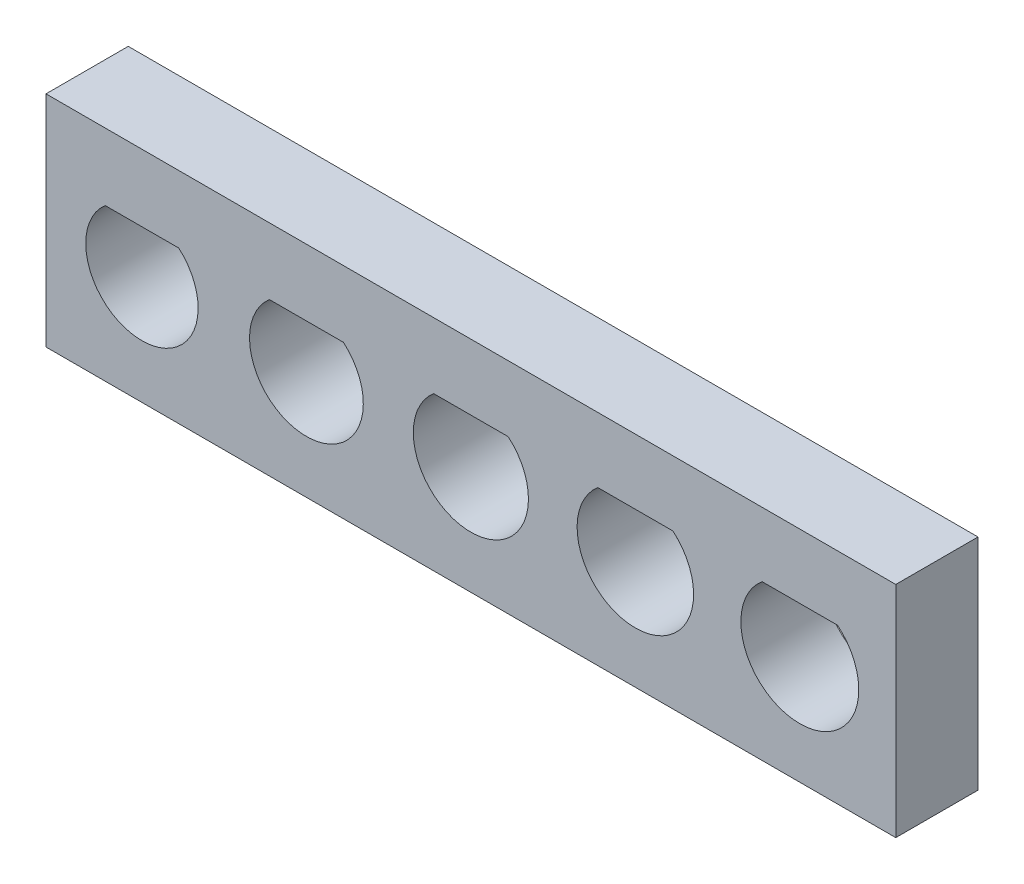
ISO-10303-21;
HEADER;
FILE_DESCRIPTION(('STEP AP214'),'2;1');
FILE_NAME('part.step','',(''),(''),'','','');
FILE_SCHEMA(('AUTOMOTIVE_DESIGN { 1 0 10303 214 1 1 1 1 }'));
ENDSEC;
DATA;
#1=APPLICATION_CONTEXT('core data for automotive mechanical design processes');
#2=APPLICATION_PROTOCOL_DEFINITION('international standard','automotive_design',2000,#1);
#3=PRODUCT_CONTEXT('',#1,'mechanical');
#4=PRODUCT('Part','Part','',(#3));
#5=PRODUCT_RELATED_PRODUCT_CATEGORY('part','',(#4));
#6=PRODUCT_DEFINITION_FORMATION('','',#4);
#7=PRODUCT_DEFINITION_CONTEXT('part definition',#1,'design');
#8=PRODUCT_DEFINITION('design','',#6,#7);
#9=PRODUCT_DEFINITION_SHAPE('','',#8);
#10=(LENGTH_UNIT() NAMED_UNIT(*) SI_UNIT(.MILLI.,.METRE.));
#11=(NAMED_UNIT(*) PLANE_ANGLE_UNIT() SI_UNIT($,.RADIAN.));
#12=(NAMED_UNIT(*) SI_UNIT($,.STERADIAN.) SOLID_ANGLE_UNIT());
#13=UNCERTAINTY_MEASURE_WITH_UNIT(LENGTH_MEASURE(1.E-05),#10,'distance_accuracy_value','');
#14=(GEOMETRIC_REPRESENTATION_CONTEXT(3) GLOBAL_UNCERTAINTY_ASSIGNED_CONTEXT((#13)) GLOBAL_UNIT_ASSIGNED_CONTEXT((#10,
#11,#12)) REPRESENTATION_CONTEXT('',''));
#15=CARTESIAN_POINT('',(0.,0.,0.));
#16=DIRECTION('',(0.,0.,1.));
#17=DIRECTION('',(1.,0.,0.));
#18=AXIS2_PLACEMENT_3D('',#15,#16,#17);
#19=CARTESIAN_POINT('',(0.,0.,3.));
#20=DIRECTION('',(0.,0.,-1.));
#21=DIRECTION('',(-1.,0.,0.));
#22=AXIS2_PLACEMENT_3D('',#19,#20,#21);
#23=PLANE('',#22);
#24=CARTESIAN_POINT('',(21.5,4.,3.));
#25=DIRECTION('',(0.,0.,1.));
#26=DIRECTION('',(1.,0.,0.));
#27=AXIS2_PLACEMENT_3D('',#24,#25,#26);
#28=CIRCLE('',#27,2.125);
#29=CARTESIAN_POINT('',(20.1306936062371,5.625,3.));
#30=VERTEX_POINT('',#29);
#31=CARTESIAN_POINT('',(22.8693063937629,5.625,3.));
#32=VERTEX_POINT('',#31);
#33=EDGE_CURVE('E155',#30,#32,#28,.T.);
#34=ORIENTED_EDGE('',*,*,#33,.F.);
#35=DIRECTION('',(-1.,0.,0.));
#36=VECTOR('',#35,1.);
#37=CARTESIAN_POINT('',(20.1306936062371,5.625,3.));
#38=LINE('',#37,#36);
#39=EDGE_CURVE('E158',#32,#30,#38,.T.);
#40=ORIENTED_EDGE('',*,*,#39,.F.);
#41=EDGE_LOOP('',(#34,#40));
#42=FACE_BOUND('',#41,.T.);
#43=CARTESIAN_POINT('',(9.5,4.,3.));
#44=DIRECTION('',(0.,0.,1.));
#45=DIRECTION('',(1.,0.,0.));
#46=AXIS2_PLACEMENT_3D('',#43,#44,#45);
#47=CIRCLE('',#46,2.075);
#48=CARTESIAN_POINT('',(8.14907439138937,5.575,3.));
#49=VERTEX_POINT('',#48);
#50=CARTESIAN_POINT('',(10.8509256086106,5.575,3.));
#51=VERTEX_POINT('',#50);
#52=EDGE_CURVE('E189',#49,#51,#47,.T.);
#53=ORIENTED_EDGE('',*,*,#52,.F.);
#54=DIRECTION('',(-1.,0.,0.));
#55=VECTOR('',#54,1.);
#56=CARTESIAN_POINT('',(8.14907439138937,5.575,3.));
#57=LINE('',#56,#55);
#58=EDGE_CURVE('E192',#51,#49,#57,.T.);
#59=ORIENTED_EDGE('',*,*,#58,.F.);
#60=EDGE_LOOP('',(#53,#59));
#61=FACE_BOUND('',#60,.T.);
#62=DIRECTION('',(0.,-1.,0.));
#63=VECTOR('',#62,1.);
#64=CARTESIAN_POINT('',(0.,0.,3.));
#65=LINE('',#64,#63);
#66=CARTESIAN_POINT('',(0.,8.,3.));
#67=VERTEX_POINT('',#66);
#68=CARTESIAN_POINT('',(0.,0.,3.));
#69=VERTEX_POINT('',#68);
#70=EDGE_CURVE('E223',#67,#69,#65,.T.);
#71=ORIENTED_EDGE('',*,*,#70,.T.);
#72=DIRECTION('',(1.,0.,0.));
#73=VECTOR('',#72,1.);
#74=CARTESIAN_POINT('',(0.,0.,3.));
#75=LINE('',#74,#73);
#76=CARTESIAN_POINT('',(31.,0.,3.));
#77=VERTEX_POINT('',#76);
#78=EDGE_CURVE('E226',#69,#77,#75,.T.);
#79=ORIENTED_EDGE('',*,*,#78,.T.);
#80=DIRECTION('',(0.,1.,0.));
#81=VECTOR('',#80,1.);
#82=CARTESIAN_POINT('',(31.,0.,3.));
#83=LINE('',#82,#81);
#84=CARTESIAN_POINT('',(31.,8.,3.));
#85=VERTEX_POINT('',#84);
#86=EDGE_CURVE('E229',#77,#85,#83,.T.);
#87=ORIENTED_EDGE('',*,*,#86,.T.);
#88=DIRECTION('',(-1.,0.,0.));
#89=VECTOR('',#88,1.);
#90=CARTESIAN_POINT('',(0.,8.,3.));
#91=LINE('',#90,#89);
#92=EDGE_CURVE('E231',#85,#67,#91,.T.);
#93=ORIENTED_EDGE('',*,*,#92,.T.);
#94=EDGE_LOOP('',(#71,#79,#87,#93));
#95=FACE_BOUND('',#94,.T.);
#96=CARTESIAN_POINT('',(3.5,4.,3.));
#97=DIRECTION('',(0.,0.,1.));
#98=DIRECTION('',(1.,0.,0.));
#99=AXIS2_PLACEMENT_3D('',#96,#97,#98);
#100=CIRCLE('',#99,2.05);
#101=CARTESIAN_POINT('',(2.15835921350013,5.55,3.));
#102=VERTEX_POINT('',#101);
#103=CARTESIAN_POINT('',(4.84164078649987,5.55,3.));
#104=VERTEX_POINT('',#103);
#105=EDGE_CURVE('E206',#102,#104,#100,.T.);
#106=ORIENTED_EDGE('',*,*,#105,.F.);
#107=DIRECTION('',(-1.,0.,0.));
#108=VECTOR('',#107,1.);
#109=CARTESIAN_POINT('',(2.15835921350013,5.55,3.));
#110=LINE('',#109,#108);
#111=EDGE_CURVE('E209',#104,#102,#110,.T.);
#112=ORIENTED_EDGE('',*,*,#111,.F.);
#113=EDGE_LOOP('',(#106,#112));
#114=FACE_BOUND('',#113,.T.);
#115=CARTESIAN_POINT('',(15.5,4.,3.));
#116=DIRECTION('',(0.,0.,1.));
#117=DIRECTION('',(1.,0.,0.));
#118=AXIS2_PLACEMENT_3D('',#115,#116,#117);
#119=CIRCLE('',#118,2.1);
#120=CARTESIAN_POINT('',(14.1398529491265,5.6,3.));
#121=VERTEX_POINT('',#120);
#122=CARTESIAN_POINT('',(16.8601470508735,5.6,3.));
#123=VERTEX_POINT('',#122);
#124=EDGE_CURVE('E172',#121,#123,#119,.T.);
#125=ORIENTED_EDGE('',*,*,#124,.F.);
#126=DIRECTION('',(-1.,0.,0.));
#127=VECTOR('',#126,1.);
#128=CARTESIAN_POINT('',(14.1398529491265,5.6,3.));
#129=LINE('',#128,#127);
#130=EDGE_CURVE('E175',#123,#121,#129,.T.);
#131=ORIENTED_EDGE('',*,*,#130,.F.);
#132=EDGE_LOOP('',(#125,#131));
#133=FACE_BOUND('',#132,.T.);
#134=CARTESIAN_POINT('',(27.5,4.,3.));
#135=DIRECTION('',(0.,0.,1.));
#136=DIRECTION('',(1.,0.,0.));
#137=AXIS2_PLACEMENT_3D('',#134,#135,#136);
#138=CIRCLE('',#137,2.15);
#139=CARTESIAN_POINT('',(26.121595124791,5.65,3.));
#140=VERTEX_POINT('',#139);
#141=CARTESIAN_POINT('',(28.878404875209,5.65,3.));
#142=VERTEX_POINT('',#141);
#143=EDGE_CURVE('E144',#140,#142,#138,.T.);
#144=ORIENTED_EDGE('',*,*,#143,.F.);
#145=DIRECTION('',(-1.,0.,0.));
#146=VECTOR('',#145,1.);
#147=CARTESIAN_POINT('',(26.121595124791,5.65,3.));
#148=LINE('',#147,#146);
#149=EDGE_CURVE('E138',#142,#140,#148,.T.);
#150=ORIENTED_EDGE('',*,*,#149,.F.);
#151=EDGE_LOOP('',(#144,#150));
#152=FACE_BOUND('',#151,.T.);
#153=ADVANCED_FACE('F38',(#42,#61,#95,#114,#133,#152),#23,.F.);
#154=CARTESIAN_POINT('',(0.,0.,0.));
#155=DIRECTION('',(0.,0.,-1.));
#156=DIRECTION('',(-1.,0.,0.));
#157=AXIS2_PLACEMENT_3D('',#154,#155,#156);
#158=PLANE('',#157);
#159=DIRECTION('',(0.,-1.,0.));
#160=VECTOR('',#159,1.);
#161=CARTESIAN_POINT('',(0.,0.,0.));
#162=LINE('',#161,#160);
#163=CARTESIAN_POINT('',(0.,8.,0.));
#164=VERTEX_POINT('',#163);
#165=CARTESIAN_POINT('',(0.,0.,0.));
#166=VERTEX_POINT('',#165);
#167=EDGE_CURVE('E222',#164,#166,#162,.T.);
#168=ORIENTED_EDGE('',*,*,#167,.F.);
#169=DIRECTION('',(-1.,0.,0.));
#170=VECTOR('',#169,1.);
#171=CARTESIAN_POINT('',(0.,8.,0.));
#172=LINE('',#171,#170);
#173=CARTESIAN_POINT('',(31.,8.,0.));
#174=VERTEX_POINT('',#173);
#175=EDGE_CURVE('E227',#174,#164,#172,.T.);
#176=ORIENTED_EDGE('',*,*,#175,.F.);
#177=DIRECTION('',(0.,1.,0.));
#178=VECTOR('',#177,1.);
#179=CARTESIAN_POINT('',(31.,0.,0.));
#180=LINE('',#179,#178);
#181=CARTESIAN_POINT('',(31.,0.,0.));
#182=VERTEX_POINT('',#181);
#183=EDGE_CURVE('E238',#182,#174,#180,.T.);
#184=ORIENTED_EDGE('',*,*,#183,.F.);
#185=DIRECTION('',(1.,0.,0.));
#186=VECTOR('',#185,1.);
#187=CARTESIAN_POINT('',(0.,0.,0.));
#188=LINE('',#187,#186);
#189=EDGE_CURVE('E236',#166,#182,#188,.T.);
#190=ORIENTED_EDGE('',*,*,#189,.F.);
#191=EDGE_LOOP('',(#168,#176,#184,#190));
#192=FACE_BOUND('',#191,.T.);
#193=DIRECTION('',(-1.,0.,0.));
#194=VECTOR('',#193,1.);
#195=CARTESIAN_POINT('',(2.15835921350013,5.55,0.));
#196=LINE('',#195,#194);
#197=CARTESIAN_POINT('',(4.84164078649987,5.55,0.));
#198=VERTEX_POINT('',#197);
#199=CARTESIAN_POINT('',(2.15835921350013,5.55,0.));
#200=VERTEX_POINT('',#199);
#201=EDGE_CURVE('E210',#198,#200,#196,.T.);
#202=ORIENTED_EDGE('',*,*,#201,.T.);
#203=CARTESIAN_POINT('',(3.5,4.,0.));
#204=DIRECTION('',(0.,0.,1.));
#205=DIRECTION('',(1.,0.,0.));
#206=AXIS2_PLACEMENT_3D('',#203,#204,#205);
#207=CIRCLE('',#206,2.05);
#208=EDGE_CURVE('E205',#200,#198,#207,.T.);
#209=ORIENTED_EDGE('',*,*,#208,.T.);
#210=EDGE_LOOP('',(#202,#209));
#211=FACE_BOUND('',#210,.T.);
#212=DIRECTION('',(-1.,0.,0.));
#213=VECTOR('',#212,1.);
#214=CARTESIAN_POINT('',(8.14907439138937,5.575,0.));
#215=LINE('',#214,#213);
#216=CARTESIAN_POINT('',(10.8509256086106,5.575,0.));
#217=VERTEX_POINT('',#216);
#218=CARTESIAN_POINT('',(8.14907439138937,5.575,0.));
#219=VERTEX_POINT('',#218);
#220=EDGE_CURVE('E193',#217,#219,#215,.T.);
#221=ORIENTED_EDGE('',*,*,#220,.T.);
#222=CARTESIAN_POINT('',(9.5,4.,0.));
#223=DIRECTION('',(0.,0.,1.));
#224=DIRECTION('',(1.,0.,0.));
#225=AXIS2_PLACEMENT_3D('',#222,#223,#224);
#226=CIRCLE('',#225,2.075);
#227=EDGE_CURVE('E188',#219,#217,#226,.T.);
#228=ORIENTED_EDGE('',*,*,#227,.T.);
#229=EDGE_LOOP('',(#221,#228));
#230=FACE_BOUND('',#229,.T.);
#231=DIRECTION('',(-1.,0.,0.));
#232=VECTOR('',#231,1.);
#233=CARTESIAN_POINT('',(14.1398529491265,5.6,0.));
#234=LINE('',#233,#232);
#235=CARTESIAN_POINT('',(16.8601470508735,5.6,0.));
#236=VERTEX_POINT('',#235);
#237=CARTESIAN_POINT('',(14.1398529491265,5.6,0.));
#238=VERTEX_POINT('',#237);
#239=EDGE_CURVE('E176',#236,#238,#234,.T.);
#240=ORIENTED_EDGE('',*,*,#239,.T.);
#241=CARTESIAN_POINT('',(15.5,4.,0.));
#242=DIRECTION('',(0.,0.,1.));
#243=DIRECTION('',(1.,0.,0.));
#244=AXIS2_PLACEMENT_3D('',#241,#242,#243);
#245=CIRCLE('',#244,2.1);
#246=EDGE_CURVE('E171',#238,#236,#245,.T.);
#247=ORIENTED_EDGE('',*,*,#246,.T.);
#248=EDGE_LOOP('',(#240,#247));
#249=FACE_BOUND('',#248,.T.);
#250=DIRECTION('',(-1.,0.,0.));
#251=VECTOR('',#250,1.);
#252=CARTESIAN_POINT('',(20.1306936062371,5.625,0.));
#253=LINE('',#252,#251);
#254=CARTESIAN_POINT('',(22.8693063937629,5.625,0.));
#255=VERTEX_POINT('',#254);
#256=CARTESIAN_POINT('',(20.1306936062371,5.625,0.));
#257=VERTEX_POINT('',#256);
#258=EDGE_CURVE('E159',#255,#257,#253,.T.);
#259=ORIENTED_EDGE('',*,*,#258,.T.);
#260=CARTESIAN_POINT('',(21.5,4.,0.));
#261=DIRECTION('',(0.,0.,1.));
#262=DIRECTION('',(1.,0.,0.));
#263=AXIS2_PLACEMENT_3D('',#260,#261,#262);
#264=CIRCLE('',#263,2.125);
#265=EDGE_CURVE('E154',#257,#255,#264,.T.);
#266=ORIENTED_EDGE('',*,*,#265,.T.);
#267=EDGE_LOOP('',(#259,#266));
#268=FACE_BOUND('',#267,.T.);
#269=DIRECTION('',(-1.,0.,0.));
#270=VECTOR('',#269,1.);
#271=CARTESIAN_POINT('',(26.121595124791,5.65,0.));
#272=LINE('',#271,#270);
#273=CARTESIAN_POINT('',(28.878404875209,5.65,0.));
#274=VERTEX_POINT('',#273);
#275=CARTESIAN_POINT('',(26.121595124791,5.65,0.));
#276=VERTEX_POINT('',#275);
#277=EDGE_CURVE('E148',#274,#276,#272,.T.);
#278=ORIENTED_EDGE('',*,*,#277,.T.);
#279=CARTESIAN_POINT('',(27.5,4.,0.));
#280=DIRECTION('',(0.,0.,1.));
#281=DIRECTION('',(1.,0.,0.));
#282=AXIS2_PLACEMENT_3D('',#279,#280,#281);
#283=CIRCLE('',#282,2.15);
#284=EDGE_CURVE('E60',#276,#274,#283,.T.);
#285=ORIENTED_EDGE('',*,*,#284,.T.);
#286=EDGE_LOOP('',(#278,#285));
#287=FACE_BOUND('',#286,.T.);
#288=ADVANCED_FACE('F256',(#192,#211,#230,#249,#268,#287),#158,.T.);
#289=CARTESIAN_POINT('',(0.,0.,3.));
#290=DIRECTION('',(1.,0.,0.));
#291=DIRECTION('',(0.,0.,-1.));
#292=AXIS2_PLACEMENT_3D('',#289,#290,#291);
#293=PLANE('',#292);
#294=ORIENTED_EDGE('',*,*,#167,.T.);
#295=DIRECTION('',(0.,0.,-1.));
#296=VECTOR('',#295,1.);
#297=CARTESIAN_POINT('',(0.,0.,3.));
#298=LINE('',#297,#296);
#299=EDGE_CURVE('E11',#69,#166,#298,.T.);
#300=ORIENTED_EDGE('',*,*,#299,.F.);
#301=ORIENTED_EDGE('',*,*,#70,.F.);
#302=DIRECTION('',(0.,0.,-1.));
#303=VECTOR('',#302,1.);
#304=CARTESIAN_POINT('',(0.,8.,3.));
#305=LINE('',#304,#303);
#306=EDGE_CURVE('E233',#67,#164,#305,.T.);
#307=ORIENTED_EDGE('',*,*,#306,.T.);
#308=EDGE_LOOP('',(#294,#300,#301,#307));
#309=FACE_BOUND('',#308,.T.);
#310=ADVANCED_FACE('F40',(#309),#293,.F.);
#311=CARTESIAN_POINT('',(0.,0.,3.));
#312=DIRECTION('',(0.,1.,0.));
#313=DIRECTION('',(0.,0.,1.));
#314=AXIS2_PLACEMENT_3D('',#311,#312,#313);
#315=PLANE('',#314);
#316=ORIENTED_EDGE('',*,*,#189,.T.);
#317=DIRECTION('',(0.,0.,-1.));
#318=VECTOR('',#317,1.);
#319=CARTESIAN_POINT('',(31.,0.,3.));
#320=LINE('',#319,#318);
#321=EDGE_CURVE('E46',#77,#182,#320,.T.);
#322=ORIENTED_EDGE('',*,*,#321,.F.);
#323=ORIENTED_EDGE('',*,*,#78,.F.);
#324=ORIENTED_EDGE('',*,*,#299,.T.);
#325=EDGE_LOOP('',(#316,#322,#323,#324));
#326=FACE_BOUND('',#325,.T.);
#327=ADVANCED_FACE('F267',(#326),#315,.F.);
#328=CARTESIAN_POINT('',(31.,0.,3.));
#329=DIRECTION('',(-1.,0.,0.));
#330=DIRECTION('',(0.,0.,1.));
#331=AXIS2_PLACEMENT_3D('',#328,#329,#330);
#332=PLANE('',#331);
#333=ORIENTED_EDGE('',*,*,#183,.T.);
#334=DIRECTION('',(0.,0.,-1.));
#335=VECTOR('',#334,1.);
#336=CARTESIAN_POINT('',(31.,8.,3.));
#337=LINE('',#336,#335);
#338=EDGE_CURVE('E243',#85,#174,#337,.T.);
#339=ORIENTED_EDGE('',*,*,#338,.F.);
#340=ORIENTED_EDGE('',*,*,#86,.F.);
#341=ORIENTED_EDGE('',*,*,#321,.T.);
#342=EDGE_LOOP('',(#333,#339,#340,#341));
#343=FACE_BOUND('',#342,.T.);
#344=ADVANCED_FACE('F250',(#343),#332,.F.);
#345=CARTESIAN_POINT('',(0.,8.,3.));
#346=DIRECTION('',(0.,-1.,0.));
#347=DIRECTION('',(0.,0.,-1.));
#348=AXIS2_PLACEMENT_3D('',#345,#346,#347);
#349=PLANE('',#348);
#350=ORIENTED_EDGE('',*,*,#175,.T.);
#351=ORIENTED_EDGE('',*,*,#306,.F.);
#352=ORIENTED_EDGE('',*,*,#92,.F.);
#353=ORIENTED_EDGE('',*,*,#338,.T.);
#354=EDGE_LOOP('',(#350,#351,#352,#353));
#355=FACE_BOUND('',#354,.T.);
#356=ADVANCED_FACE('F260',(#355),#349,.F.);
#357=CARTESIAN_POINT('',(3.5,4.,3.));
#358=DIRECTION('',(0.,0.,-1.));
#359=DIRECTION('',(-1.,0.,0.));
#360=AXIS2_PLACEMENT_3D('',#357,#358,#359);
#361=CYLINDRICAL_SURFACE('',#360,2.05);
#362=ORIENTED_EDGE('',*,*,#208,.F.);
#363=DIRECTION('',(0.,0.,-1.));
#364=VECTOR('',#363,1.);
#365=CARTESIAN_POINT('',(2.15835921350013,5.55,3.));
#366=LINE('',#365,#364);
#367=EDGE_CURVE('E212',#102,#200,#366,.T.);
#368=ORIENTED_EDGE('',*,*,#367,.F.);
#369=ORIENTED_EDGE('',*,*,#105,.T.);
#370=DIRECTION('',(0.,0.,-1.));
#371=VECTOR('',#370,1.);
#372=CARTESIAN_POINT('',(4.84164078649987,5.55,3.));
#373=LINE('',#372,#371);
#374=EDGE_CURVE('E219',#104,#198,#373,.T.);
#375=ORIENTED_EDGE('',*,*,#374,.T.);
#376=EDGE_LOOP('',(#362,#368,#369,#375));
#377=FACE_BOUND('',#376,.T.);
#378=ADVANCED_FACE('F284',(#377),#361,.F.);
#379=CARTESIAN_POINT('',(2.15835921350013,5.55,3.));
#380=DIRECTION('',(0.,-1.,0.));
#381=DIRECTION('',(0.,0.,-1.));
#382=AXIS2_PLACEMENT_3D('',#379,#380,#381);
#383=PLANE('',#382);
#384=ORIENTED_EDGE('',*,*,#201,.F.);
#385=ORIENTED_EDGE('',*,*,#374,.F.);
#386=ORIENTED_EDGE('',*,*,#111,.T.);
#387=ORIENTED_EDGE('',*,*,#367,.T.);
#388=EDGE_LOOP('',(#384,#385,#386,#387));
#389=FACE_BOUND('',#388,.T.);
#390=ADVANCED_FACE('F291',(#389),#383,.T.);
#391=CARTESIAN_POINT('',(9.5,4.,3.));
#392=DIRECTION('',(0.,0.,-1.));
#393=DIRECTION('',(-1.,0.,0.));
#394=AXIS2_PLACEMENT_3D('',#391,#392,#393);
#395=CYLINDRICAL_SURFACE('',#394,2.075);
#396=ORIENTED_EDGE('',*,*,#227,.F.);
#397=DIRECTION('',(0.,0.,-1.));
#398=VECTOR('',#397,1.);
#399=CARTESIAN_POINT('',(8.14907439138937,5.575,3.));
#400=LINE('',#399,#398);
#401=EDGE_CURVE('E195',#49,#219,#400,.T.);
#402=ORIENTED_EDGE('',*,*,#401,.F.);
#403=ORIENTED_EDGE('',*,*,#52,.T.);
#404=DIRECTION('',(0.,0.,-1.));
#405=VECTOR('',#404,1.);
#406=CARTESIAN_POINT('',(10.8509256086106,5.575,3.));
#407=LINE('',#406,#405);
#408=EDGE_CURVE('E202',#51,#217,#407,.T.);
#409=ORIENTED_EDGE('',*,*,#408,.T.);
#410=EDGE_LOOP('',(#396,#402,#403,#409));
#411=FACE_BOUND('',#410,.T.);
#412=ADVANCED_FACE('F296',(#411),#395,.F.);
#413=CARTESIAN_POINT('',(8.14907439138937,5.575,3.));
#414=DIRECTION('',(0.,-1.,0.));
#415=DIRECTION('',(1.,0.,0.));
#416=AXIS2_PLACEMENT_3D('',#413,#414,#415);
#417=PLANE('',#416);
#418=ORIENTED_EDGE('',*,*,#220,.F.);
#419=ORIENTED_EDGE('',*,*,#408,.F.);
#420=ORIENTED_EDGE('',*,*,#58,.T.);
#421=ORIENTED_EDGE('',*,*,#401,.T.);
#422=EDGE_LOOP('',(#418,#419,#420,#421));
#423=FACE_BOUND('',#422,.T.);
#424=ADVANCED_FACE('F326',(#423),#417,.T.);
#425=CARTESIAN_POINT('',(15.5,4.,3.));
#426=DIRECTION('',(0.,0.,-1.));
#427=DIRECTION('',(-1.,0.,0.));
#428=AXIS2_PLACEMENT_3D('',#425,#426,#427);
#429=CYLINDRICAL_SURFACE('',#428,2.1);
#430=ORIENTED_EDGE('',*,*,#246,.F.);
#431=DIRECTION('',(0.,0.,-1.));
#432=VECTOR('',#431,1.);
#433=CARTESIAN_POINT('',(14.1398529491265,5.6,3.));
#434=LINE('',#433,#432);
#435=EDGE_CURVE('E178',#121,#238,#434,.T.);
#436=ORIENTED_EDGE('',*,*,#435,.F.);
#437=ORIENTED_EDGE('',*,*,#124,.T.);
#438=DIRECTION('',(0.,0.,-1.));
#439=VECTOR('',#438,1.);
#440=CARTESIAN_POINT('',(16.8601470508735,5.6,3.));
#441=LINE('',#440,#439);
#442=EDGE_CURVE('E185',#123,#236,#441,.T.);
#443=ORIENTED_EDGE('',*,*,#442,.T.);
#444=EDGE_LOOP('',(#430,#436,#437,#443));
#445=FACE_BOUND('',#444,.T.);
#446=ADVANCED_FACE('F319',(#445),#429,.F.);
#447=CARTESIAN_POINT('',(14.1398529491265,5.6,3.));
#448=DIRECTION('',(0.,-1.,0.));
#449=DIRECTION('',(1.,0.,0.));
#450=AXIS2_PLACEMENT_3D('',#447,#448,#449);
#451=PLANE('',#450);
#452=ORIENTED_EDGE('',*,*,#239,.F.);
#453=ORIENTED_EDGE('',*,*,#442,.F.);
#454=ORIENTED_EDGE('',*,*,#130,.T.);
#455=ORIENTED_EDGE('',*,*,#435,.T.);
#456=EDGE_LOOP('',(#452,#453,#454,#455));
#457=FACE_BOUND('',#456,.T.);
#458=ADVANCED_FACE('F312',(#457),#451,.T.);
#459=CARTESIAN_POINT('',(21.5,4.,3.));
#460=DIRECTION('',(0.,0.,-1.));
#461=DIRECTION('',(-1.,0.,0.));
#462=AXIS2_PLACEMENT_3D('',#459,#460,#461);
#463=CYLINDRICAL_SURFACE('',#462,2.125);
#464=ORIENTED_EDGE('',*,*,#265,.F.);
#465=DIRECTION('',(0.,0.,-1.));
#466=VECTOR('',#465,1.);
#467=CARTESIAN_POINT('',(20.1306936062371,5.625,3.));
#468=LINE('',#467,#466);
#469=EDGE_CURVE('E161',#30,#257,#468,.T.);
#470=ORIENTED_EDGE('',*,*,#469,.F.);
#471=ORIENTED_EDGE('',*,*,#33,.T.);
#472=DIRECTION('',(0.,0.,-1.));
#473=VECTOR('',#472,1.);
#474=CARTESIAN_POINT('',(22.8693063937629,5.625,3.));
#475=LINE('',#474,#473);
#476=EDGE_CURVE('E168',#32,#255,#475,.T.);
#477=ORIENTED_EDGE('',*,*,#476,.T.);
#478=EDGE_LOOP('',(#464,#470,#471,#477));
#479=FACE_BOUND('',#478,.T.);
#480=ADVANCED_FACE('F309',(#479),#463,.F.);
#481=CARTESIAN_POINT('',(20.1306936062371,5.625,3.));
#482=DIRECTION('',(0.,-1.,0.));
#483=DIRECTION('',(0.,0.,-1.));
#484=AXIS2_PLACEMENT_3D('',#481,#482,#483);
#485=PLANE('',#484);
#486=ORIENTED_EDGE('',*,*,#258,.F.);
#487=ORIENTED_EDGE('',*,*,#476,.F.);
#488=ORIENTED_EDGE('',*,*,#39,.T.);
#489=ORIENTED_EDGE('',*,*,#469,.T.);
#490=EDGE_LOOP('',(#486,#487,#488,#489));
#491=FACE_BOUND('',#490,.T.);
#492=ADVANCED_FACE('F306',(#491),#485,.T.);
#493=CARTESIAN_POINT('',(27.5,4.,3.));
#494=DIRECTION('',(0.,0.,-1.));
#495=DIRECTION('',(-1.,0.,0.));
#496=AXIS2_PLACEMENT_3D('',#493,#494,#495);
#497=CYLINDRICAL_SURFACE('',#496,2.15);
#498=ORIENTED_EDGE('',*,*,#284,.F.);
#499=DIRECTION('',(0.,0.,-1.));
#500=VECTOR('',#499,1.);
#501=CARTESIAN_POINT('',(26.121595124791,5.65,3.));
#502=LINE('',#501,#500);
#503=EDGE_CURVE('E140',#140,#276,#502,.T.);
#504=ORIENTED_EDGE('',*,*,#503,.F.);
#505=ORIENTED_EDGE('',*,*,#143,.T.);
#506=DIRECTION('',(0.,0.,-1.));
#507=VECTOR('',#506,1.);
#508=CARTESIAN_POINT('',(28.878404875209,5.65,3.));
#509=LINE('',#508,#507);
#510=EDGE_CURVE('E53',#142,#274,#509,.T.);
#511=ORIENTED_EDGE('',*,*,#510,.T.);
#512=EDGE_LOOP('',(#498,#504,#505,#511));
#513=FACE_BOUND('',#512,.T.);
#514=ADVANCED_FACE('F146',(#513),#497,.F.);
#515=CARTESIAN_POINT('',(26.121595124791,5.65,3.));
#516=DIRECTION('',(0.,-1.,0.));
#517=DIRECTION('',(0.,0.,-1.));
#518=AXIS2_PLACEMENT_3D('',#515,#516,#517);
#519=PLANE('',#518);
#520=ORIENTED_EDGE('',*,*,#277,.F.);
#521=ORIENTED_EDGE('',*,*,#510,.F.);
#522=ORIENTED_EDGE('',*,*,#149,.T.);
#523=ORIENTED_EDGE('',*,*,#503,.T.);
#524=EDGE_LOOP('',(#520,#521,#522,#523));
#525=FACE_BOUND('',#524,.T.);
#526=ADVANCED_FACE('F139',(#525),#519,.T.);
#527=CLOSED_SHELL('',(#153,#288,#310,#327,#344,#356,#378,#390,#412,#424,#446,#458,#480,#492,
#514,#526));
#528=MANIFOLD_SOLID_BREP('B2',#527);
#529=ADVANCED_BREP_SHAPE_REPRESENTATION('',(#18,#528),#14);
#530=SHAPE_DEFINITION_REPRESENTATION(#9,#529);
ENDSEC;
END-ISO-10303-21;
